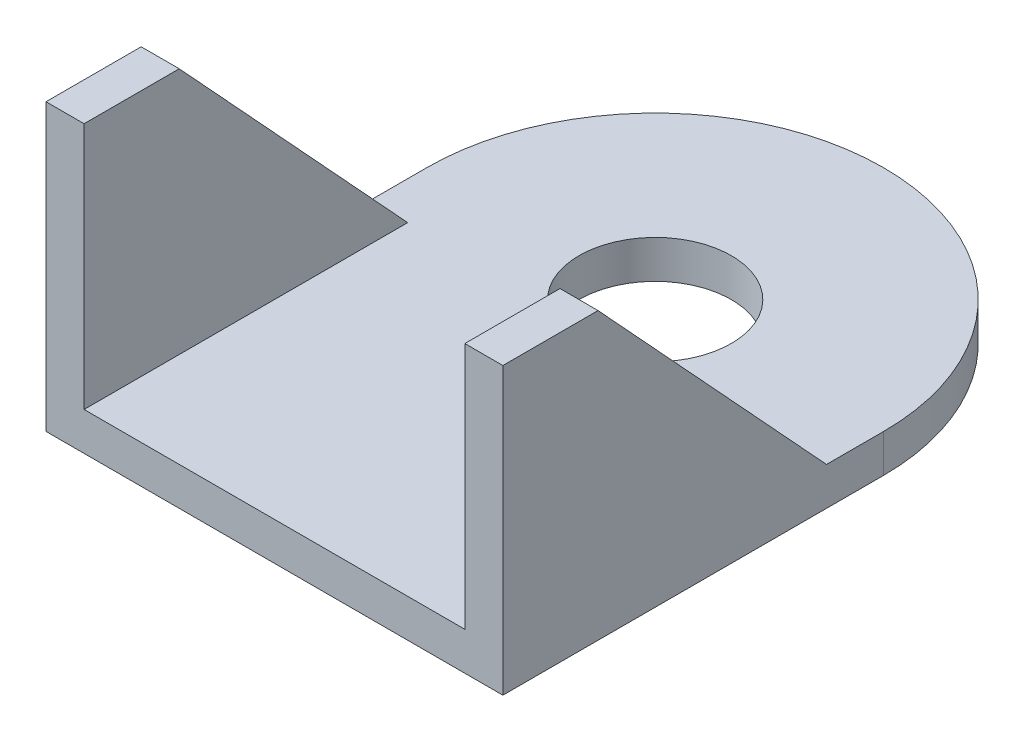
ISO-10303-21;
HEADER;
FILE_DESCRIPTION(('STEP AP214'),'2;1');
FILE_NAME('part.step','',(''),(''),'','','');
FILE_SCHEMA(('AUTOMOTIVE_DESIGN { 1 0 10303 214 1 1 1 1 }'));
ENDSEC;
DATA;
#1=APPLICATION_CONTEXT('core data for automotive mechanical design processes');
#2=APPLICATION_PROTOCOL_DEFINITION('international standard','automotive_design',2000,#1);
#3=PRODUCT_CONTEXT('',#1,'mechanical');
#4=PRODUCT('Part','Part','',(#3));
#5=PRODUCT_RELATED_PRODUCT_CATEGORY('part','',(#4));
#6=PRODUCT_DEFINITION_FORMATION('','',#4);
#7=PRODUCT_DEFINITION_CONTEXT('part definition',#1,'design');
#8=PRODUCT_DEFINITION('design','',#6,#7);
#9=PRODUCT_DEFINITION_SHAPE('','',#8);
#10=(LENGTH_UNIT() NAMED_UNIT(*) SI_UNIT(.MILLI.,.METRE.));
#11=(NAMED_UNIT(*) PLANE_ANGLE_UNIT() SI_UNIT($,.RADIAN.));
#12=(NAMED_UNIT(*) SI_UNIT($,.STERADIAN.) SOLID_ANGLE_UNIT());
#13=UNCERTAINTY_MEASURE_WITH_UNIT(LENGTH_MEASURE(1.E-05),#10,'distance_accuracy_value','');
#14=(GEOMETRIC_REPRESENTATION_CONTEXT(3) GLOBAL_UNCERTAINTY_ASSIGNED_CONTEXT((#13)) GLOBAL_UNIT_ASSIGNED_CONTEXT((#10,
#11,#12)) REPRESENTATION_CONTEXT('',''));
#15=CARTESIAN_POINT('',(0.,0.,0.));
#16=DIRECTION('',(0.,0.,1.));
#17=DIRECTION('',(1.,0.,0.));
#18=AXIS2_PLACEMENT_3D('',#15,#16,#17);
#19=CARTESIAN_POINT('',(0.,2.,0.));
#20=DIRECTION('',(0.,1.,0.));
#21=DIRECTION('',(0.,0.,1.));
#22=AXIS2_PLACEMENT_3D('',#19,#20,#21);
#23=PLANE('',#22);
#24=CARTESIAN_POINT('',(0.,2.,0.));
#25=DIRECTION('',(0.,1.,0.));
#26=DIRECTION('',(0.,0.,1.));
#27=AXIS2_PLACEMENT_3D('',#24,#25,#26);
#28=CIRCLE('',#27,4.);
#29=CARTESIAN_POINT('',(0.,2.,4.));
#30=VERTEX_POINT('',#29);
#31=EDGE_CURVE('E130',#30,#30,#28,.T.);
#32=ORIENTED_EDGE('',*,*,#31,.F.);
#33=EDGE_LOOP('',(#32));
#34=FACE_BOUND('',#33,.T.);
#35=DIRECTION('',(0.,0.,1.));
#36=VECTOR('',#35,1.);
#37=CARTESIAN_POINT('',(-12.,2.,0.));
#38=LINE('',#37,#36);
#39=CARTESIAN_POINT('',(-12.,2.,0.));
#40=VERTEX_POINT('',#39);
#41=CARTESIAN_POINT('',(-12.,2.,3.));
#42=VERTEX_POINT('',#41);
#43=EDGE_CURVE('E66',#40,#42,#38,.T.);
#44=ORIENTED_EDGE('',*,*,#43,.T.);
#45=DIRECTION('',(-1.,0.,0.));
#46=VECTOR('',#45,1.);
#47=CARTESIAN_POINT('',(-10.,2.,3.));
#48=LINE('',#47,#46);
#49=CARTESIAN_POINT('',(-10.,2.,3.));
#50=VERTEX_POINT('',#49);
#51=EDGE_CURVE('E61',#50,#42,#48,.T.);
#52=ORIENTED_EDGE('',*,*,#51,.F.);
#53=DIRECTION('',(0.,0.,-1.));
#54=VECTOR('',#53,1.);
#55=CARTESIAN_POINT('',(-10.,2.,0.));
#56=LINE('',#55,#54);
#57=CARTESIAN_POINT('',(-10.,2.,20.));
#58=VERTEX_POINT('',#57);
#59=EDGE_CURVE('E132',#58,#50,#56,.T.);
#60=ORIENTED_EDGE('',*,*,#59,.F.);
#61=DIRECTION('',(1.,0.,0.));
#62=VECTOR('',#61,1.);
#63=CARTESIAN_POINT('',(0.,2.,20.));
#64=LINE('',#63,#62);
#65=CARTESIAN_POINT('',(10.,2.,20.));
#66=VERTEX_POINT('',#65);
#67=EDGE_CURVE('E121',#58,#66,#64,.T.);
#68=ORIENTED_EDGE('',*,*,#67,.T.);
#69=DIRECTION('',(0.,0.,-1.));
#70=VECTOR('',#69,1.);
#71=CARTESIAN_POINT('',(10.,2.,3.));
#72=LINE('',#71,#70);
#73=CARTESIAN_POINT('',(10.,2.,3.));
#74=VERTEX_POINT('',#73);
#75=EDGE_CURVE('E157',#66,#74,#72,.T.);
#76=ORIENTED_EDGE('',*,*,#75,.T.);
#77=DIRECTION('',(1.,0.,0.));
#78=VECTOR('',#77,1.);
#79=CARTESIAN_POINT('',(10.,2.,3.));
#80=LINE('',#79,#78);
#81=CARTESIAN_POINT('',(12.,2.,3.));
#82=VERTEX_POINT('',#81);
#83=EDGE_CURVE('E167',#74,#82,#80,.T.);
#84=ORIENTED_EDGE('',*,*,#83,.T.);
#85=DIRECTION('',(0.,0.,-1.));
#86=VECTOR('',#85,1.);
#87=CARTESIAN_POINT('',(12.,2.,0.));
#88=LINE('',#87,#86);
#89=CARTESIAN_POINT('',(12.,2.,0.));
#90=VERTEX_POINT('',#89);
#91=EDGE_CURVE('E180',#82,#90,#88,.T.);
#92=ORIENTED_EDGE('',*,*,#91,.T.);
#93=CARTESIAN_POINT('',(0.,2.,0.));
#94=DIRECTION('',(0.,1.,0.));
#95=DIRECTION('',(0.,0.,1.));
#96=AXIS2_PLACEMENT_3D('',#93,#94,#95);
#97=CIRCLE('',#96,12.);
#98=EDGE_CURVE('E182',#90,#40,#97,.T.);
#99=ORIENTED_EDGE('',*,*,#98,.T.);
#100=EDGE_LOOP('',(#44,#52,#60,#68,#76,#84,#92,#99));
#101=FACE_BOUND('',#100,.T.);
#102=ADVANCED_FACE('F45',(#34,#101),#23,.T.);
#103=CARTESIAN_POINT('',(0.,0.,0.));
#104=DIRECTION('',(0.,1.,0.));
#105=DIRECTION('',(0.,0.,1.));
#106=AXIS2_PLACEMENT_3D('',#103,#104,#105);
#107=PLANE('',#106);
#108=CARTESIAN_POINT('',(0.,0.,0.));
#109=DIRECTION('',(0.,1.,0.));
#110=DIRECTION('',(0.,0.,1.));
#111=AXIS2_PLACEMENT_3D('',#108,#109,#110);
#112=CIRCLE('',#111,12.);
#113=CARTESIAN_POINT('',(12.,0.,0.));
#114=VERTEX_POINT('',#113);
#115=CARTESIAN_POINT('',(-12.,0.,0.));
#116=VERTEX_POINT('',#115);
#117=EDGE_CURVE('E11',#114,#116,#112,.F.);
#118=ORIENTED_EDGE('',*,*,#117,.F.);
#119=DIRECTION('',(0.,0.,-1.));
#120=VECTOR('',#119,1.);
#121=CARTESIAN_POINT('',(12.,0.,0.));
#122=LINE('',#121,#120);
#123=CARTESIAN_POINT('',(12.,0.,20.));
#124=VERTEX_POINT('',#123);
#125=EDGE_CURVE('E175',#124,#114,#122,.T.);
#126=ORIENTED_EDGE('',*,*,#125,.F.);
#127=DIRECTION('',(1.,0.,0.));
#128=VECTOR('',#127,1.);
#129=CARTESIAN_POINT('',(0.,0.,20.));
#130=LINE('',#129,#128);
#131=CARTESIAN_POINT('',(-12.,0.,20.));
#132=VERTEX_POINT('',#131);
#133=EDGE_CURVE('E196',#132,#124,#130,.T.);
#134=ORIENTED_EDGE('',*,*,#133,.F.);
#135=DIRECTION('',(0.,0.,1.));
#136=VECTOR('',#135,1.);
#137=CARTESIAN_POINT('',(-12.,0.,0.));
#138=LINE('',#137,#136);
#139=EDGE_CURVE('E194',#116,#132,#138,.T.);
#140=ORIENTED_EDGE('',*,*,#139,.F.);
#141=EDGE_LOOP('',(#118,#126,#134,#140));
#142=FACE_BOUND('',#141,.T.);
#143=ADVANCED_FACE('F221',(#142),#107,.F.);
#144=CARTESIAN_POINT('',(0.,0.,0.));
#145=DIRECTION('',(0.,1.,0.));
#146=DIRECTION('',(0.,0.,1.));
#147=AXIS2_PLACEMENT_3D('',#144,#145,#146);
#148=CIRCLE('',#147,12.);
#149=EDGE_CURVE('E191',#114,#116,#148,.T.);
#150=ORIENTED_EDGE('',*,*,#149,.F.);
#151=ORIENTED_EDGE('',*,*,#117,.T.);
#152=EDGE_LOOP('',(#150,#151));
#153=FACE_BOUND('',#152,.T.);
#154=CARTESIAN_POINT('',(0.,0.,0.));
#155=DIRECTION('',(0.,1.,0.));
#156=DIRECTION('',(0.,0.,1.));
#157=AXIS2_PLACEMENT_3D('',#154,#155,#156);
#158=CIRCLE('',#157,9.);
#159=CARTESIAN_POINT('',(0.,0.,9.));
#160=VERTEX_POINT('',#159);
#161=EDGE_CURVE('E54',#160,#160,#158,.F.);
#162=ORIENTED_EDGE('',*,*,#161,.F.);
#163=EDGE_LOOP('',(#162));
#164=FACE_BOUND('',#163,.T.);
#165=ADVANCED_FACE('F219',(#153,#164),#107,.F.);
#166=CARTESIAN_POINT('',(12.,2.,0.));
#167=DIRECTION('',(-1.,0.,0.));
#168=DIRECTION('',(0.,0.,1.));
#169=AXIS2_PLACEMENT_3D('',#166,#167,#168);
#170=PLANE('',#169);
#171=ORIENTED_EDGE('',*,*,#125,.T.);
#172=DIRECTION('',(0.,-1.,0.));
#173=VECTOR('',#172,1.);
#174=CARTESIAN_POINT('',(12.,2.,0.));
#175=LINE('',#174,#173);
#176=EDGE_CURVE('E208',#90,#114,#175,.T.);
#177=ORIENTED_EDGE('',*,*,#176,.F.);
#178=ORIENTED_EDGE('',*,*,#91,.F.);
#179=DIRECTION('',(0.,0.734803444627488,0.678280102733066));
#180=VECTOR('',#179,1.);
#181=CARTESIAN_POINT('',(12.,15.,15.));
#182=LINE('',#181,#180);
#183=CARTESIAN_POINT('',(12.,15.,15.));
#184=VERTEX_POINT('',#183);
#185=EDGE_CURVE('E156',#82,#184,#182,.T.);
#186=ORIENTED_EDGE('',*,*,#185,.T.);
#187=DIRECTION('',(0.,0.,1.));
#188=VECTOR('',#187,1.);
#189=CARTESIAN_POINT('',(12.,15.,20.));
#190=LINE('',#189,#188);
#191=CARTESIAN_POINT('',(12.,15.,20.));
#192=VERTEX_POINT('',#191);
#193=EDGE_CURVE('E160',#184,#192,#190,.T.);
#194=ORIENTED_EDGE('',*,*,#193,.T.);
#195=DIRECTION('',(0.,-1.,0.));
#196=VECTOR('',#195,1.);
#197=CARTESIAN_POINT('',(12.,2.,20.));
#198=LINE('',#197,#196);
#199=EDGE_CURVE('E188',#192,#124,#198,.T.);
#200=ORIENTED_EDGE('',*,*,#199,.T.);
#201=EDGE_LOOP('',(#171,#177,#178,#186,#194,#200));
#202=FACE_BOUND('',#201,.T.);
#203=ADVANCED_FACE('F47',(#202),#170,.F.);
#204=CARTESIAN_POINT('',(0.,2.,0.));
#205=DIRECTION('',(0.,-1.,0.));
#206=DIRECTION('',(0.,0.,-1.));
#207=AXIS2_PLACEMENT_3D('',#204,#205,#206);
#208=CYLINDRICAL_SURFACE('',#207,12.);
#209=ORIENTED_EDGE('',*,*,#149,.T.);
#210=DIRECTION('',(0.,-1.,0.));
#211=VECTOR('',#210,1.);
#212=CARTESIAN_POINT('',(-12.,2.,0.));
#213=LINE('',#212,#211);
#214=EDGE_CURVE('E205',#40,#116,#213,.T.);
#215=ORIENTED_EDGE('',*,*,#214,.F.);
#216=ORIENTED_EDGE('',*,*,#98,.F.);
#217=ORIENTED_EDGE('',*,*,#176,.T.);
#218=EDGE_LOOP('',(#209,#215,#216,#217));
#219=FACE_BOUND('',#218,.T.);
#220=ADVANCED_FACE('F228',(#219),#208,.T.);
#221=CARTESIAN_POINT('',(-12.,2.,0.));
#222=DIRECTION('',(1.,0.,0.));
#223=DIRECTION('',(0.,0.,-1.));
#224=AXIS2_PLACEMENT_3D('',#221,#222,#223);
#225=PLANE('',#224);
#226=ORIENTED_EDGE('',*,*,#139,.T.);
#227=DIRECTION('',(0.,-1.,0.));
#228=VECTOR('',#227,1.);
#229=CARTESIAN_POINT('',(-12.,2.,20.));
#230=LINE('',#229,#228);
#231=CARTESIAN_POINT('',(-12.,15.,20.));
#232=VERTEX_POINT('',#231);
#233=EDGE_CURVE('E202',#232,#132,#230,.T.);
#234=ORIENTED_EDGE('',*,*,#233,.F.);
#235=DIRECTION('',(0.,0.,1.));
#236=VECTOR('',#235,1.);
#237=CARTESIAN_POINT('',(-12.,15.,0.));
#238=LINE('',#237,#236);
#239=CARTESIAN_POINT('',(-12.,15.,15.));
#240=VERTEX_POINT('',#239);
#241=EDGE_CURVE('E141',#240,#232,#238,.T.);
#242=ORIENTED_EDGE('',*,*,#241,.F.);
#243=DIRECTION('',(0.,0.734803444627488,0.678280102733066));
#244=VECTOR('',#243,1.);
#245=CARTESIAN_POINT('',(-12.,0.504792332268372,1.61980830670927));
#246=LINE('',#245,#244);
#247=EDGE_CURVE('E144',#42,#240,#246,.T.);
#248=ORIENTED_EDGE('',*,*,#247,.F.);
#249=ORIENTED_EDGE('',*,*,#43,.F.);
#250=ORIENTED_EDGE('',*,*,#214,.T.);
#251=EDGE_LOOP('',(#226,#234,#242,#248,#249,#250));
#252=FACE_BOUND('',#251,.T.);
#253=ADVANCED_FACE('F304',(#252),#225,.F.);
#254=CARTESIAN_POINT('',(0.,2.,20.));
#255=DIRECTION('',(0.,0.,-1.));
#256=DIRECTION('',(-1.,0.,0.));
#257=AXIS2_PLACEMENT_3D('',#254,#255,#256);
#258=PLANE('',#257);
#259=ORIENTED_EDGE('',*,*,#133,.T.);
#260=ORIENTED_EDGE('',*,*,#199,.F.);
#261=DIRECTION('',(1.,0.,0.));
#262=VECTOR('',#261,1.);
#263=CARTESIAN_POINT('',(10.,15.,20.));
#264=LINE('',#263,#262);
#265=CARTESIAN_POINT('',(10.,15.,20.));
#266=VERTEX_POINT('',#265);
#267=EDGE_CURVE('E172',#266,#192,#264,.T.);
#268=ORIENTED_EDGE('',*,*,#267,.F.);
#269=DIRECTION('',(0.,-1.,0.));
#270=VECTOR('',#269,1.);
#271=CARTESIAN_POINT('',(10.,2.,20.));
#272=LINE('',#271,#270);
#273=EDGE_CURVE('E127',#266,#66,#272,.T.);
#274=ORIENTED_EDGE('',*,*,#273,.T.);
#275=ORIENTED_EDGE('',*,*,#67,.F.);
#276=DIRECTION('',(0.,-1.,0.));
#277=VECTOR('',#276,1.);
#278=CARTESIAN_POINT('',(-10.,2.,20.));
#279=LINE('',#278,#277);
#280=CARTESIAN_POINT('',(-10.,15.,20.));
#281=VERTEX_POINT('',#280);
#282=EDGE_CURVE('E125',#281,#58,#279,.T.);
#283=ORIENTED_EDGE('',*,*,#282,.F.);
#284=DIRECTION('',(-1.,0.,0.));
#285=VECTOR('',#284,1.);
#286=CARTESIAN_POINT('',(-10.,15.,20.));
#287=LINE('',#286,#285);
#288=EDGE_CURVE('E149',#281,#232,#287,.T.);
#289=ORIENTED_EDGE('',*,*,#288,.T.);
#290=ORIENTED_EDGE('',*,*,#233,.T.);
#291=EDGE_LOOP('',(#259,#260,#268,#274,#275,#283,#289,#290));
#292=FACE_BOUND('',#291,.T.);
#293=ADVANCED_FACE('F122',(#292),#258,.F.);
#294=CARTESIAN_POINT('',(0.,2.,0.));
#295=DIRECTION('',(0.,-1.,0.));
#296=DIRECTION('',(0.,0.,-1.));
#297=AXIS2_PLACEMENT_3D('',#294,#295,#296);
#298=CYLINDRICAL_SURFACE('',#297,4.);
#299=ORIENTED_EDGE('',*,*,#31,.T.);
#300=EDGE_LOOP('',(#299));
#301=FACE_BOUND('',#300,.T.);
#302=CARTESIAN_POINT('',(0.,0.,0.));
#303=DIRECTION('',(0.,1.,0.));
#304=DIRECTION('',(0.,0.,1.));
#305=AXIS2_PLACEMENT_3D('',#302,#303,#304);
#306=CIRCLE('',#305,4.);
#307=CARTESIAN_POINT('',(0.,0.,4.));
#308=VERTEX_POINT('',#307);
#309=EDGE_CURVE('E183',#308,#308,#306,.T.);
#310=ORIENTED_EDGE('',*,*,#309,.F.);
#311=EDGE_LOOP('',(#310));
#312=FACE_BOUND('',#311,.T.);
#313=ADVANCED_FACE('F236',(#301,#312),#298,.F.);
#314=ORIENTED_EDGE('',*,*,#161,.T.);
#315=EDGE_LOOP('',(#314));
#316=FACE_BOUND('',#315,.T.);
#317=ORIENTED_EDGE('',*,*,#309,.T.);
#318=EDGE_LOOP('',(#317));
#319=FACE_BOUND('',#318,.T.);
#320=ADVANCED_FACE('F216',(#316,#319),#107,.F.);
#321=CARTESIAN_POINT('',(10.,15.,20.));
#322=DIRECTION('',(0.,1.,0.));
#323=DIRECTION('',(0.,0.,1.));
#324=AXIS2_PLACEMENT_3D('',#321,#322,#323);
#325=PLANE('',#324);
#326=ORIENTED_EDGE('',*,*,#193,.F.);
#327=DIRECTION('',(1.,0.,0.));
#328=VECTOR('',#327,1.);
#329=CARTESIAN_POINT('',(10.,15.,15.));
#330=LINE('',#329,#328);
#331=CARTESIAN_POINT('',(10.,15.,15.));
#332=VERTEX_POINT('',#331);
#333=EDGE_CURVE('E176',#332,#184,#330,.T.);
#334=ORIENTED_EDGE('',*,*,#333,.F.);
#335=DIRECTION('',(0.,0.,1.));
#336=VECTOR('',#335,1.);
#337=CARTESIAN_POINT('',(10.,15.,20.));
#338=LINE('',#337,#336);
#339=EDGE_CURVE('E163',#332,#266,#338,.T.);
#340=ORIENTED_EDGE('',*,*,#339,.T.);
#341=ORIENTED_EDGE('',*,*,#267,.T.);
#342=EDGE_LOOP('',(#326,#334,#340,#341));
#343=FACE_BOUND('',#342,.T.);
#344=ADVANCED_FACE('F235',(#343),#325,.T.);
#345=CARTESIAN_POINT('',(10.,15.,15.));
#346=DIRECTION('',(0.,0.678280102733066,-0.734803444627488));
#347=DIRECTION('',(0.,0.734803444627488,0.678280102733066));
#348=AXIS2_PLACEMENT_3D('',#345,#346,#347);
#349=PLANE('',#348);
#350=ORIENTED_EDGE('',*,*,#185,.F.);
#351=ORIENTED_EDGE('',*,*,#83,.F.);
#352=DIRECTION('',(0.,0.734803444627488,0.678280102733066));
#353=VECTOR('',#352,1.);
#354=CARTESIAN_POINT('',(10.,15.,15.));
#355=LINE('',#354,#353);
#356=EDGE_CURVE('E159',#74,#332,#355,.T.);
#357=ORIENTED_EDGE('',*,*,#356,.T.);
#358=ORIENTED_EDGE('',*,*,#333,.T.);
#359=EDGE_LOOP('',(#350,#351,#357,#358));
#360=FACE_BOUND('',#359,.T.);
#361=ADVANCED_FACE('F243',(#360),#349,.T.);
#362=CARTESIAN_POINT('',(10.,0.,0.));
#363=DIRECTION('',(-1.,0.,0.));
#364=DIRECTION('',(0.,0.,1.));
#365=AXIS2_PLACEMENT_3D('',#362,#363,#364);
#366=PLANE('',#365);
#367=ORIENTED_EDGE('',*,*,#75,.F.);
#368=ORIENTED_EDGE('',*,*,#273,.F.);
#369=ORIENTED_EDGE('',*,*,#339,.F.);
#370=ORIENTED_EDGE('',*,*,#356,.F.);
#371=EDGE_LOOP('',(#367,#368,#369,#370));
#372=FACE_BOUND('',#371,.T.);
#373=ADVANCED_FACE('F246',(#372),#366,.T.);
#374=CARTESIAN_POINT('',(-10.,0.504792332268372,1.61980830670927));
#375=DIRECTION('',(0.,-0.678280102733066,0.734803444627488));
#376=DIRECTION('',(0.,-0.734803444627488,-0.678280102733066));
#377=AXIS2_PLACEMENT_3D('',#374,#375,#376);
#378=PLANE('',#377);
#379=ORIENTED_EDGE('',*,*,#247,.T.);
#380=DIRECTION('',(-1.,0.,0.));
#381=VECTOR('',#380,1.);
#382=CARTESIAN_POINT('',(-10.,15.,15.));
#383=LINE('',#382,#381);
#384=CARTESIAN_POINT('',(-10.,15.,15.));
#385=VERTEX_POINT('',#384);
#386=EDGE_CURVE('E152',#385,#240,#383,.T.);
#387=ORIENTED_EDGE('',*,*,#386,.F.);
#388=DIRECTION('',(0.,0.734803444627488,0.678280102733066));
#389=VECTOR('',#388,1.);
#390=CARTESIAN_POINT('',(-10.,0.504792332268372,1.61980830670927));
#391=LINE('',#390,#389);
#392=EDGE_CURVE('E135',#50,#385,#391,.T.);
#393=ORIENTED_EDGE('',*,*,#392,.F.);
#394=ORIENTED_EDGE('',*,*,#51,.T.);
#395=EDGE_LOOP('',(#379,#387,#393,#394));
#396=FACE_BOUND('',#395,.T.);
#397=ADVANCED_FACE('F253',(#396),#378,.F.);
#398=CARTESIAN_POINT('',(-10.,15.,0.));
#399=DIRECTION('',(0.,-1.,0.));
#400=DIRECTION('',(0.,0.,-1.));
#401=AXIS2_PLACEMENT_3D('',#398,#399,#400);
#402=PLANE('',#401);
#403=ORIENTED_EDGE('',*,*,#241,.T.);
#404=ORIENTED_EDGE('',*,*,#288,.F.);
#405=DIRECTION('',(0.,0.,1.));
#406=VECTOR('',#405,1.);
#407=CARTESIAN_POINT('',(-10.,15.,0.));
#408=LINE('',#407,#406);
#409=EDGE_CURVE('E139',#385,#281,#408,.T.);
#410=ORIENTED_EDGE('',*,*,#409,.F.);
#411=ORIENTED_EDGE('',*,*,#386,.T.);
#412=EDGE_LOOP('',(#403,#404,#410,#411));
#413=FACE_BOUND('',#412,.T.);
#414=ADVANCED_FACE('F257',(#413),#402,.F.);
#415=CARTESIAN_POINT('',(-10.,0.,0.));
#416=DIRECTION('',(1.,0.,0.));
#417=DIRECTION('',(0.,0.,-1.));
#418=AXIS2_PLACEMENT_3D('',#415,#416,#417);
#419=PLANE('',#418);
#420=ORIENTED_EDGE('',*,*,#282,.T.);
#421=ORIENTED_EDGE('',*,*,#59,.T.);
#422=ORIENTED_EDGE('',*,*,#392,.T.);
#423=ORIENTED_EDGE('',*,*,#409,.T.);
#424=EDGE_LOOP('',(#420,#421,#422,#423));
#425=FACE_BOUND('',#424,.T.);
#426=ADVANCED_FACE('F137',(#425),#419,.T.);
#427=CLOSED_SHELL('',(#102,#143,#165,#203,#220,#253,#293,#313,#320,#344,#361,#373,#397,#414,#426));
#428=MANIFOLD_SOLID_BREP('B2',#427);
#429=ADVANCED_BREP_SHAPE_REPRESENTATION('',(#18,#428),#14);
#430=SHAPE_DEFINITION_REPRESENTATION(#9,#429);
ENDSEC;
END-ISO-10303-21;
